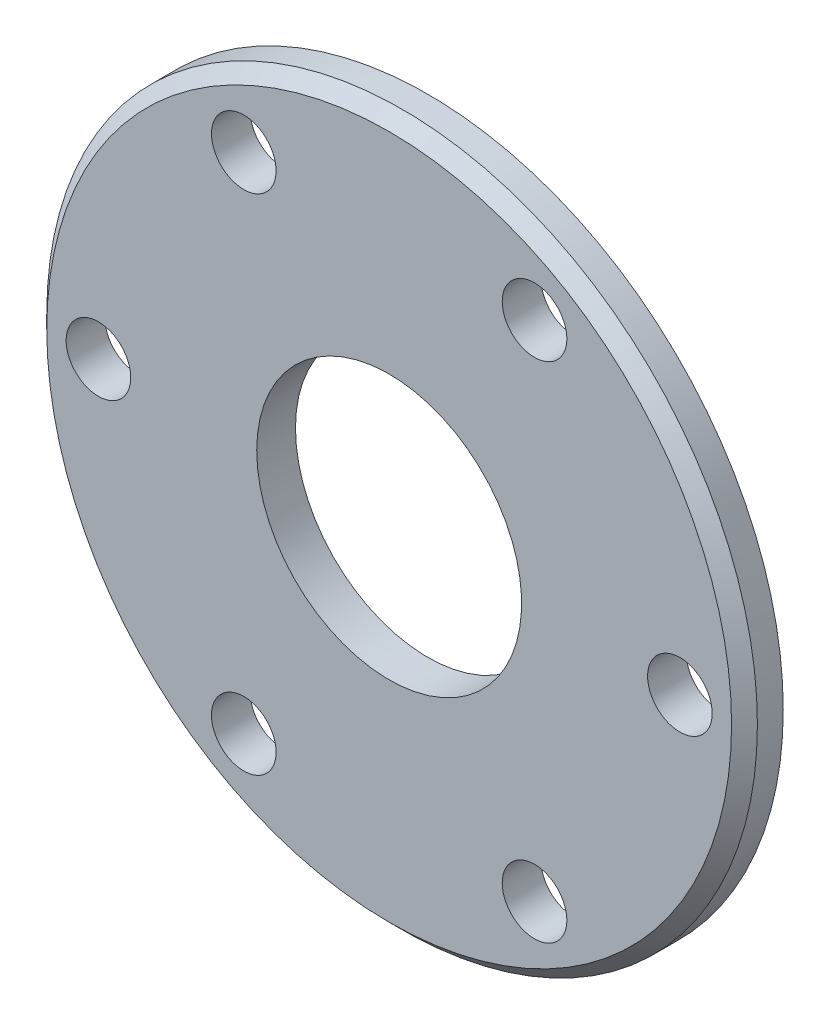
ISO-10303-21;
HEADER;
FILE_DESCRIPTION(('STEP AP214'),'2;1');
FILE_NAME('part.step','',(''),(''),'','','');
FILE_SCHEMA(('AUTOMOTIVE_DESIGN { 1 0 10303 214 1 1 1 1 }'));
ENDSEC;
DATA;
#1=APPLICATION_CONTEXT('core data for automotive mechanical design processes');
#2=APPLICATION_PROTOCOL_DEFINITION('international standard','automotive_design',2000,#1);
#3=PRODUCT_CONTEXT('',#1,'mechanical');
#4=PRODUCT('Part','Part','',(#3));
#5=PRODUCT_RELATED_PRODUCT_CATEGORY('part','',(#4));
#6=PRODUCT_DEFINITION_FORMATION('','',#4);
#7=PRODUCT_DEFINITION_CONTEXT('part definition',#1,'design');
#8=PRODUCT_DEFINITION('design','',#6,#7);
#9=PRODUCT_DEFINITION_SHAPE('','',#8);
#10=(LENGTH_UNIT() NAMED_UNIT(*) SI_UNIT(.MILLI.,.METRE.));
#11=(NAMED_UNIT(*) PLANE_ANGLE_UNIT() SI_UNIT($,.RADIAN.));
#12=(NAMED_UNIT(*) SI_UNIT($,.STERADIAN.) SOLID_ANGLE_UNIT());
#13=UNCERTAINTY_MEASURE_WITH_UNIT(LENGTH_MEASURE(1.E-05),#10,'distance_accuracy_value','');
#14=(GEOMETRIC_REPRESENTATION_CONTEXT(3) GLOBAL_UNCERTAINTY_ASSIGNED_CONTEXT((#13)) GLOBAL_UNIT_ASSIGNED_CONTEXT((#10,
#11,#12)) REPRESENTATION_CONTEXT('',''));
#15=CARTESIAN_POINT('',(0.,0.,0.));
#16=DIRECTION('',(0.,0.,1.));
#17=DIRECTION('',(1.,0.,0.));
#18=AXIS2_PLACEMENT_3D('',#15,#16,#17);
#19=CARTESIAN_POINT('',(0.,0.,0.));
#20=DIRECTION('',(0.,0.,1.));
#21=DIRECTION('',(1.,0.,0.));
#22=AXIS2_PLACEMENT_3D('',#19,#20,#21);
#23=CYLINDRICAL_SURFACE('',#22,27.5);
#24=CARTESIAN_POINT('',(0.,0.,1.99999603496438));
#25=DIRECTION('',(0.,0.,1.));
#26=DIRECTION('',(1.,0.,0.));
#27=AXIS2_PLACEMENT_3D('',#24,#25,#26);
#28=CIRCLE('',#27,27.5);
#29=CARTESIAN_POINT('',(27.5,0.,1.99999603496438));
#30=VERTEX_POINT('',#29);
#31=EDGE_CURVE('E10',#30,#30,#28,.F.);
#32=ORIENTED_EDGE('',*,*,#31,.T.);
#33=EDGE_LOOP('',(#32));
#34=FACE_BOUND('',#33,.T.);
#35=CARTESIAN_POINT('',(0.,0.,0.));
#36=DIRECTION('',(0.,0.,1.));
#37=DIRECTION('',(1.,0.,0.));
#38=AXIS2_PLACEMENT_3D('',#35,#36,#37);
#39=CIRCLE('',#38,27.5);
#40=CARTESIAN_POINT('',(27.5,0.,0.));
#41=VERTEX_POINT('',#40);
#42=EDGE_CURVE('E43',#41,#41,#39,.T.);
#43=ORIENTED_EDGE('',*,*,#42,.T.);
#44=EDGE_LOOP('',(#43));
#45=FACE_BOUND('',#44,.T.);
#46=ADVANCED_FACE('F32',(#34,#45),#23,.T.);
#47=CARTESIAN_POINT('',(27.5,0.,0.));
#48=DIRECTION('',(0.,0.,-1.));
#49=DIRECTION('',(-1.,0.,0.));
#50=AXIS2_PLACEMENT_3D('',#47,#48,#49);
#51=PLANE('',#50);
#52=CARTESIAN_POINT('',(0.,0.,0.));
#53=DIRECTION('',(0.,0.,-1.));
#54=DIRECTION('',(-1.,0.,0.));
#55=AXIS2_PLACEMENT_3D('',#52,#53,#54);
#56=CIRCLE('',#55,10.25);
#57=CARTESIAN_POINT('',(-10.25,0.,0.));
#58=VERTEX_POINT('',#57);
#59=EDGE_CURVE('E88',#58,#58,#56,.T.);
#60=ORIENTED_EDGE('',*,*,#59,.F.);
#61=EDGE_LOOP('',(#60));
#62=FACE_BOUND('',#61,.T.);
#63=CARTESIAN_POINT('',(22.5,0.,0.));
#64=DIRECTION('',(0.,0.,-1.));
#65=DIRECTION('',(-1.,0.,0.));
#66=AXIS2_PLACEMENT_3D('',#63,#64,#65);
#67=CIRCLE('',#66,2.49999999999999);
#68=CARTESIAN_POINT('',(20.,0.,0.));
#69=VERTEX_POINT('',#68);
#70=EDGE_CURVE('E82',#69,#69,#67,.T.);
#71=ORIENTED_EDGE('',*,*,#70,.F.);
#72=EDGE_LOOP('',(#71));
#73=FACE_BOUND('',#72,.T.);
#74=CARTESIAN_POINT('',(11.25,19.48557158515,0.));
#75=DIRECTION('',(0.,0.,-1.));
#76=DIRECTION('',(-1.,0.,0.));
#77=AXIS2_PLACEMENT_3D('',#74,#75,#76);
#78=CIRCLE('',#77,2.49999999999999);
#79=CARTESIAN_POINT('',(8.75000000000001,19.48557158515,0.));
#80=VERTEX_POINT('',#79);
#81=EDGE_CURVE('E76',#80,#80,#78,.T.);
#82=ORIENTED_EDGE('',*,*,#81,.F.);
#83=EDGE_LOOP('',(#82));
#84=FACE_BOUND('',#83,.T.);
#85=CARTESIAN_POINT('',(-11.25,19.48557158515,0.));
#86=DIRECTION('',(0.,0.,-1.));
#87=DIRECTION('',(-1.,0.,0.));
#88=AXIS2_PLACEMENT_3D('',#85,#86,#87);
#89=CIRCLE('',#88,2.49999999999999);
#90=CARTESIAN_POINT('',(-13.75,19.48557158515,0.));
#91=VERTEX_POINT('',#90);
#92=EDGE_CURVE('E70',#91,#91,#89,.T.);
#93=ORIENTED_EDGE('',*,*,#92,.F.);
#94=EDGE_LOOP('',(#93));
#95=FACE_BOUND('',#94,.T.);
#96=CARTESIAN_POINT('',(-22.5,0.,0.));
#97=DIRECTION('',(0.,0.,-1.));
#98=DIRECTION('',(-1.,0.,0.));
#99=AXIS2_PLACEMENT_3D('',#96,#97,#98);
#100=CIRCLE('',#99,2.49999999999999);
#101=CARTESIAN_POINT('',(-25.,0.,0.));
#102=VERTEX_POINT('',#101);
#103=EDGE_CURVE('E64',#102,#102,#100,.T.);
#104=ORIENTED_EDGE('',*,*,#103,.F.);
#105=EDGE_LOOP('',(#104));
#106=FACE_BOUND('',#105,.T.);
#107=CARTESIAN_POINT('',(-11.25,-19.48557158515,0.));
#108=DIRECTION('',(0.,0.,-1.));
#109=DIRECTION('',(-1.,0.,0.));
#110=AXIS2_PLACEMENT_3D('',#107,#108,#109);
#111=CIRCLE('',#110,2.49999999999999);
#112=CARTESIAN_POINT('',(-13.75,-19.48557158515,0.));
#113=VERTEX_POINT('',#112);
#114=EDGE_CURVE('E58',#113,#113,#111,.T.);
#115=ORIENTED_EDGE('',*,*,#114,.F.);
#116=EDGE_LOOP('',(#115));
#117=FACE_BOUND('',#116,.T.);
#118=CARTESIAN_POINT('',(11.25,-19.48557158515,0.));
#119=DIRECTION('',(0.,0.,-1.));
#120=DIRECTION('',(-1.,0.,0.));
#121=AXIS2_PLACEMENT_3D('',#118,#119,#120);
#122=CIRCLE('',#121,2.49999999999999);
#123=CARTESIAN_POINT('',(8.75000000000001,-19.48557158515,0.));
#124=VERTEX_POINT('',#123);
#125=EDGE_CURVE('E52',#124,#124,#122,.T.);
#126=ORIENTED_EDGE('',*,*,#125,.F.);
#127=EDGE_LOOP('',(#126));
#128=FACE_BOUND('',#127,.T.);
#129=ORIENTED_EDGE('',*,*,#42,.F.);
#130=EDGE_LOOP('',(#129));
#131=FACE_BOUND('',#130,.T.);
#132=ADVANCED_FACE('F94',(#62,#73,#84,#95,#106,#117,#128,#131),#51,.T.);
#133=CARTESIAN_POINT('',(0.,0.,3.));
#134=DIRECTION('',(0.,0.,1.));
#135=DIRECTION('',(1.,0.,0.));
#136=AXIS2_PLACEMENT_3D('',#133,#134,#135);
#137=PLANE('',#136);
#138=CARTESIAN_POINT('',(0.,0.,3.));
#139=DIRECTION('',(0.,0.,1.));
#140=DIRECTION('',(1.,0.,0.));
#141=AXIS2_PLACEMENT_3D('',#138,#139,#140);
#142=CIRCLE('',#141,26.499996199797);
#143=CARTESIAN_POINT('',(26.499996199797,0.,3.));
#144=VERTEX_POINT('',#143);
#145=EDGE_CURVE('E39',#144,#144,#142,.T.);
#146=ORIENTED_EDGE('',*,*,#145,.T.);
#147=EDGE_LOOP('',(#146));
#148=FACE_BOUND('',#147,.T.);
#149=CARTESIAN_POINT('',(0.,0.,3.));
#150=DIRECTION('',(0.,0.,-1.));
#151=DIRECTION('',(-1.,0.,0.));
#152=AXIS2_PLACEMENT_3D('',#149,#150,#151);
#153=CIRCLE('',#152,10.25);
#154=CARTESIAN_POINT('',(-10.25,0.,3.));
#155=VERTEX_POINT('',#154);
#156=EDGE_CURVE('E85',#155,#155,#153,.T.);
#157=ORIENTED_EDGE('',*,*,#156,.T.);
#158=EDGE_LOOP('',(#157));
#159=FACE_BOUND('',#158,.T.);
#160=CARTESIAN_POINT('',(22.5,0.,3.));
#161=DIRECTION('',(0.,0.,-1.));
#162=DIRECTION('',(-1.,0.,0.));
#163=AXIS2_PLACEMENT_3D('',#160,#161,#162);
#164=CIRCLE('',#163,2.49999999999998);
#165=CARTESIAN_POINT('',(20.,0.,3.));
#166=VERTEX_POINT('',#165);
#167=EDGE_CURVE('E79',#166,#166,#164,.T.);
#168=ORIENTED_EDGE('',*,*,#167,.T.);
#169=EDGE_LOOP('',(#168));
#170=FACE_BOUND('',#169,.T.);
#171=CARTESIAN_POINT('',(11.25,19.48557158515,3.));
#172=DIRECTION('',(0.,0.,-1.));
#173=DIRECTION('',(-1.,0.,0.));
#174=AXIS2_PLACEMENT_3D('',#171,#172,#173);
#175=CIRCLE('',#174,2.49999999999999);
#176=CARTESIAN_POINT('',(8.75000000000001,19.48557158515,3.));
#177=VERTEX_POINT('',#176);
#178=EDGE_CURVE('E73',#177,#177,#175,.T.);
#179=ORIENTED_EDGE('',*,*,#178,.T.);
#180=EDGE_LOOP('',(#179));
#181=FACE_BOUND('',#180,.T.);
#182=CARTESIAN_POINT('',(-11.25,19.48557158515,3.));
#183=DIRECTION('',(0.,0.,-1.));
#184=DIRECTION('',(-1.,0.,0.));
#185=AXIS2_PLACEMENT_3D('',#182,#183,#184);
#186=CIRCLE('',#185,2.49999999999999);
#187=CARTESIAN_POINT('',(-13.75,19.48557158515,3.));
#188=VERTEX_POINT('',#187);
#189=EDGE_CURVE('E67',#188,#188,#186,.T.);
#190=ORIENTED_EDGE('',*,*,#189,.T.);
#191=EDGE_LOOP('',(#190));
#192=FACE_BOUND('',#191,.T.);
#193=CARTESIAN_POINT('',(-22.5,0.,3.));
#194=DIRECTION('',(0.,0.,-1.));
#195=DIRECTION('',(-1.,0.,0.));
#196=AXIS2_PLACEMENT_3D('',#193,#194,#195);
#197=CIRCLE('',#196,2.49999999999998);
#198=CARTESIAN_POINT('',(-25.,0.,3.));
#199=VERTEX_POINT('',#198);
#200=EDGE_CURVE('E61',#199,#199,#197,.T.);
#201=ORIENTED_EDGE('',*,*,#200,.T.);
#202=EDGE_LOOP('',(#201));
#203=FACE_BOUND('',#202,.T.);
#204=CARTESIAN_POINT('',(-11.25,-19.48557158515,3.));
#205=DIRECTION('',(0.,0.,-1.));
#206=DIRECTION('',(-1.,0.,0.));
#207=AXIS2_PLACEMENT_3D('',#204,#205,#206);
#208=CIRCLE('',#207,2.49999999999999);
#209=CARTESIAN_POINT('',(-13.75,-19.48557158515,3.));
#210=VERTEX_POINT('',#209);
#211=EDGE_CURVE('E55',#210,#210,#208,.T.);
#212=ORIENTED_EDGE('',*,*,#211,.T.);
#213=EDGE_LOOP('',(#212));
#214=FACE_BOUND('',#213,.T.);
#215=CARTESIAN_POINT('',(11.25,-19.48557158515,3.));
#216=DIRECTION('',(0.,0.,-1.));
#217=DIRECTION('',(-1.,0.,0.));
#218=AXIS2_PLACEMENT_3D('',#215,#216,#217);
#219=CIRCLE('',#218,2.49999999999999);
#220=CARTESIAN_POINT('',(8.75000000000001,-19.48557158515,3.));
#221=VERTEX_POINT('',#220);
#222=EDGE_CURVE('E47',#221,#221,#219,.T.);
#223=ORIENTED_EDGE('',*,*,#222,.T.);
#224=EDGE_LOOP('',(#223));
#225=FACE_BOUND('',#224,.T.);
#226=ADVANCED_FACE('F97',(#148,#159,#170,#181,#192,#203,#214,#225),#137,.T.);
#227=CARTESIAN_POINT('',(11.25,-19.48557158515,0.));
#228=DIRECTION('',(0.,0.,-1.));
#229=DIRECTION('',(-1.,0.,0.));
#230=AXIS2_PLACEMENT_3D('',#227,#228,#229);
#231=CYLINDRICAL_SURFACE('',#230,2.49999999999999);
#232=ORIENTED_EDGE('',*,*,#222,.F.);
#233=EDGE_LOOP('',(#232));
#234=FACE_BOUND('',#233,.T.);
#235=ORIENTED_EDGE('',*,*,#125,.T.);
#236=EDGE_LOOP('',(#235));
#237=FACE_BOUND('',#236,.T.);
#238=ADVANCED_FACE('F119',(#234,#237),#231,.F.);
#239=CARTESIAN_POINT('',(-11.25,-19.48557158515,0.));
#240=DIRECTION('',(0.,0.,-1.));
#241=DIRECTION('',(-1.,0.,0.));
#242=AXIS2_PLACEMENT_3D('',#239,#240,#241);
#243=CYLINDRICAL_SURFACE('',#242,2.49999999999999);
#244=ORIENTED_EDGE('',*,*,#211,.F.);
#245=EDGE_LOOP('',(#244));
#246=FACE_BOUND('',#245,.T.);
#247=ORIENTED_EDGE('',*,*,#114,.T.);
#248=EDGE_LOOP('',(#247));
#249=FACE_BOUND('',#248,.T.);
#250=ADVANCED_FACE('F122',(#246,#249),#243,.F.);
#251=CARTESIAN_POINT('',(-22.5,0.,0.));
#252=DIRECTION('',(0.,0.,-1.));
#253=DIRECTION('',(-1.,0.,0.));
#254=AXIS2_PLACEMENT_3D('',#251,#252,#253);
#255=CYLINDRICAL_SURFACE('',#254,2.49999999999999);
#256=ORIENTED_EDGE('',*,*,#200,.F.);
#257=EDGE_LOOP('',(#256));
#258=FACE_BOUND('',#257,.T.);
#259=ORIENTED_EDGE('',*,*,#103,.T.);
#260=EDGE_LOOP('',(#259));
#261=FACE_BOUND('',#260,.T.);
#262=ADVANCED_FACE('F126',(#258,#261),#255,.F.);
#263=CARTESIAN_POINT('',(-11.25,19.48557158515,0.));
#264=DIRECTION('',(0.,0.,-1.));
#265=DIRECTION('',(-1.,0.,0.));
#266=AXIS2_PLACEMENT_3D('',#263,#264,#265);
#267=CYLINDRICAL_SURFACE('',#266,2.49999999999999);
#268=ORIENTED_EDGE('',*,*,#189,.F.);
#269=EDGE_LOOP('',(#268));
#270=FACE_BOUND('',#269,.T.);
#271=ORIENTED_EDGE('',*,*,#92,.T.);
#272=EDGE_LOOP('',(#271));
#273=FACE_BOUND('',#272,.T.);
#274=ADVANCED_FACE('F130',(#270,#273),#267,.F.);
#275=CARTESIAN_POINT('',(11.25,19.48557158515,0.));
#276=DIRECTION('',(0.,0.,-1.));
#277=DIRECTION('',(-1.,0.,0.));
#278=AXIS2_PLACEMENT_3D('',#275,#276,#277);
#279=CYLINDRICAL_SURFACE('',#278,2.49999999999999);
#280=ORIENTED_EDGE('',*,*,#178,.F.);
#281=EDGE_LOOP('',(#280));
#282=FACE_BOUND('',#281,.T.);
#283=ORIENTED_EDGE('',*,*,#81,.T.);
#284=EDGE_LOOP('',(#283));
#285=FACE_BOUND('',#284,.T.);
#286=ADVANCED_FACE('F134',(#282,#285),#279,.F.);
#287=CARTESIAN_POINT('',(22.5,0.,0.));
#288=DIRECTION('',(0.,0.,-1.));
#289=DIRECTION('',(-1.,0.,0.));
#290=AXIS2_PLACEMENT_3D('',#287,#288,#289);
#291=CYLINDRICAL_SURFACE('',#290,2.49999999999999);
#292=ORIENTED_EDGE('',*,*,#167,.F.);
#293=EDGE_LOOP('',(#292));
#294=FACE_BOUND('',#293,.T.);
#295=ORIENTED_EDGE('',*,*,#70,.T.);
#296=EDGE_LOOP('',(#295));
#297=FACE_BOUND('',#296,.T.);
#298=ADVANCED_FACE('F138',(#294,#297),#291,.F.);
#299=CARTESIAN_POINT('',(0.,0.,0.));
#300=DIRECTION('',(0.,0.,-1.));
#301=DIRECTION('',(-1.,0.,0.));
#302=AXIS2_PLACEMENT_3D('',#299,#300,#301);
#303=CYLINDRICAL_SURFACE('',#302,10.25);
#304=ORIENTED_EDGE('',*,*,#156,.F.);
#305=EDGE_LOOP('',(#304));
#306=FACE_BOUND('',#305,.T.);
#307=ORIENTED_EDGE('',*,*,#59,.T.);
#308=EDGE_LOOP('',(#307));
#309=FACE_BOUND('',#308,.T.);
#310=ADVANCED_FACE('F92',(#306,#309),#303,.F.);
#311=CARTESIAN_POINT('',(0.,0.,3.));
#312=DIRECTION('',(0.,0.,-1.));
#313=DIRECTION('',(-1.,0.,0.));
#314=AXIS2_PLACEMENT_3D('',#311,#312,#313);
#315=CONICAL_SURFACE('',#314,26.499996199797,0.785398080981462);
#316=ORIENTED_EDGE('',*,*,#31,.F.);
#317=EDGE_LOOP('',(#316));
#318=FACE_BOUND('',#317,.T.);
#319=ORIENTED_EDGE('',*,*,#145,.F.);
#320=EDGE_LOOP('',(#319));
#321=FACE_BOUND('',#320,.T.);
#322=ADVANCED_FACE('F34',(#318,#321),#315,.T.);
#323=CLOSED_SHELL('',(#46,#132,#226,#238,#250,#262,#274,#286,#298,#310,#322));
#324=MANIFOLD_SOLID_BREP('B2',#323);
#325=ADVANCED_BREP_SHAPE_REPRESENTATION('',(#18,#324),#14);
#326=SHAPE_DEFINITION_REPRESENTATION(#9,#325);
ENDSEC;
END-ISO-10303-21;
